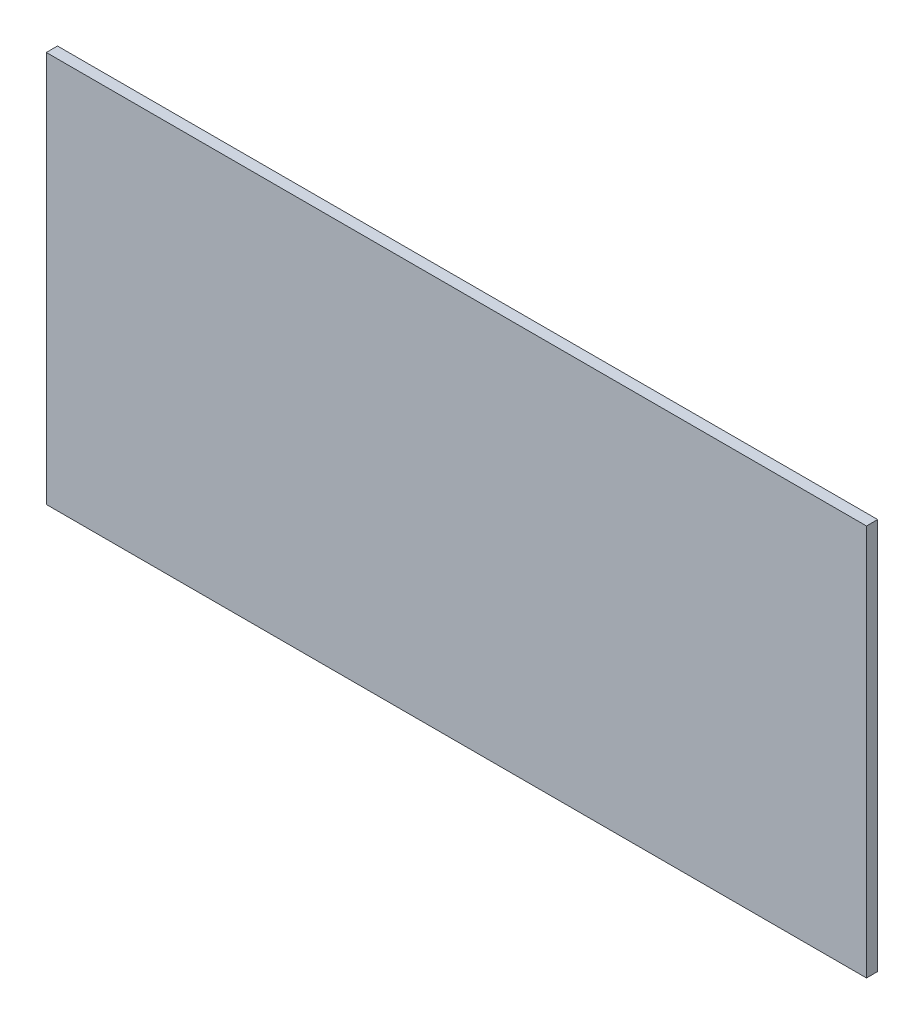
ISO-10303-21;
HEADER;
FILE_DESCRIPTION(('STEP AP214'),'2;1');
FILE_NAME('part.step','',(''),(''),'','','');
FILE_SCHEMA(('AUTOMOTIVE_DESIGN { 1 0 10303 214 1 1 1 1 }'));
ENDSEC;
DATA;
#1=APPLICATION_CONTEXT('core data for automotive mechanical design processes');
#2=APPLICATION_PROTOCOL_DEFINITION('international standard','automotive_design',2000,#1);
#3=PRODUCT_CONTEXT('',#1,'mechanical');
#4=PRODUCT('Part','Part','',(#3));
#5=PRODUCT_RELATED_PRODUCT_CATEGORY('part','',(#4));
#6=PRODUCT_DEFINITION_FORMATION('','',#4);
#7=PRODUCT_DEFINITION_CONTEXT('part definition',#1,'design');
#8=PRODUCT_DEFINITION('design','',#6,#7);
#9=PRODUCT_DEFINITION_SHAPE('','',#8);
#10=(LENGTH_UNIT() NAMED_UNIT(*) SI_UNIT(.MILLI.,.METRE.));
#11=(NAMED_UNIT(*) PLANE_ANGLE_UNIT() SI_UNIT($,.RADIAN.));
#12=(NAMED_UNIT(*) SI_UNIT($,.STERADIAN.) SOLID_ANGLE_UNIT());
#13=UNCERTAINTY_MEASURE_WITH_UNIT(LENGTH_MEASURE(1.E-05),#10,'distance_accuracy_value','');
#14=(GEOMETRIC_REPRESENTATION_CONTEXT(3) GLOBAL_UNCERTAINTY_ASSIGNED_CONTEXT((#13)) GLOBAL_UNIT_ASSIGNED_CONTEXT((#10,
#11,#12)) REPRESENTATION_CONTEXT('',''));
#15=CARTESIAN_POINT('',(0.,0.,0.));
#16=DIRECTION('',(0.,0.,1.));
#17=DIRECTION('',(1.,0.,0.));
#18=AXIS2_PLACEMENT_3D('',#15,#16,#17);
#19=CARTESIAN_POINT('',(139.7,-66.675,3.81));
#20=DIRECTION('',(-1.,0.,0.));
#21=DIRECTION('',(0.,0.,1.));
#22=AXIS2_PLACEMENT_3D('',#19,#20,#21);
#23=PLANE('',#22);
#24=DIRECTION('',(0.,1.,0.));
#25=VECTOR('',#24,1.);
#26=CARTESIAN_POINT('',(139.7,-66.675,0.));
#27=LINE('',#26,#25);
#28=CARTESIAN_POINT('',(139.7,-66.675,0.));
#29=VERTEX_POINT('',#28);
#30=CARTESIAN_POINT('',(139.7,66.675,0.));
#31=VERTEX_POINT('',#30);
#32=EDGE_CURVE('E96',#29,#31,#27,.T.);
#33=ORIENTED_EDGE('',*,*,#32,.T.);
#34=DIRECTION('',(0.,0.,-1.));
#35=VECTOR('',#34,1.);
#36=CARTESIAN_POINT('',(139.7,66.675,3.81));
#37=LINE('',#36,#35);
#38=CARTESIAN_POINT('',(139.7,66.675,3.81));
#39=VERTEX_POINT('',#38);
#40=EDGE_CURVE('E11',#39,#31,#37,.T.);
#41=ORIENTED_EDGE('',*,*,#40,.F.);
#42=DIRECTION('',(0.,1.,0.));
#43=VECTOR('',#42,1.);
#44=CARTESIAN_POINT('',(139.7,-66.675,3.81));
#45=LINE('',#44,#43);
#46=CARTESIAN_POINT('',(139.7,-66.675,3.81));
#47=VERTEX_POINT('',#46);
#48=EDGE_CURVE('E84',#47,#39,#45,.T.);
#49=ORIENTED_EDGE('',*,*,#48,.F.);
#50=DIRECTION('',(0.,0.,-1.));
#51=VECTOR('',#50,1.);
#52=CARTESIAN_POINT('',(139.7,-66.675,3.81));
#53=LINE('',#52,#51);
#54=EDGE_CURVE('E92',#47,#29,#53,.T.);
#55=ORIENTED_EDGE('',*,*,#54,.T.);
#56=EDGE_LOOP('',(#33,#41,#49,#55));
#57=FACE_BOUND('',#56,.T.);
#58=ADVANCED_FACE('F33',(#57),#23,.F.);
#59=CARTESIAN_POINT('',(-139.7,66.675,3.81));
#60=DIRECTION('',(0.,-1.,0.));
#61=DIRECTION('',(0.,0.,-1.));
#62=AXIS2_PLACEMENT_3D('',#59,#60,#61);
#63=PLANE('',#62);
#64=DIRECTION('',(-1.,0.,0.));
#65=VECTOR('',#64,1.);
#66=CARTESIAN_POINT('',(-139.7,66.675,0.));
#67=LINE('',#66,#65);
#68=CARTESIAN_POINT('',(-139.7,66.675,0.));
#69=VERTEX_POINT('',#68);
#70=EDGE_CURVE('E88',#31,#69,#67,.T.);
#71=ORIENTED_EDGE('',*,*,#70,.T.);
#72=DIRECTION('',(0.,0.,-1.));
#73=VECTOR('',#72,1.);
#74=CARTESIAN_POINT('',(-139.7,66.675,3.81));
#75=LINE('',#74,#73);
#76=CARTESIAN_POINT('',(-139.7,66.675,3.81));
#77=VERTEX_POINT('',#76);
#78=EDGE_CURVE('E41',#77,#69,#75,.T.);
#79=ORIENTED_EDGE('',*,*,#78,.F.);
#80=DIRECTION('',(-1.,0.,0.));
#81=VECTOR('',#80,1.);
#82=CARTESIAN_POINT('',(-139.7,66.675,3.81));
#83=LINE('',#82,#81);
#84=EDGE_CURVE('E79',#39,#77,#83,.T.);
#85=ORIENTED_EDGE('',*,*,#84,.F.);
#86=ORIENTED_EDGE('',*,*,#40,.T.);
#87=EDGE_LOOP('',(#71,#79,#85,#86));
#88=FACE_BOUND('',#87,.T.);
#89=ADVANCED_FACE('F87',(#88),#63,.F.);
#90=CARTESIAN_POINT('',(-139.7,-66.675,3.81));
#91=DIRECTION('',(1.,0.,0.));
#92=DIRECTION('',(0.,0.,-1.));
#93=AXIS2_PLACEMENT_3D('',#90,#91,#92);
#94=PLANE('',#93);
#95=DIRECTION('',(0.,-1.,0.));
#96=VECTOR('',#95,1.);
#97=CARTESIAN_POINT('',(-139.7,-66.675,0.));
#98=LINE('',#97,#96);
#99=CARTESIAN_POINT('',(-139.7,-66.675,0.));
#100=VERTEX_POINT('',#99);
#101=EDGE_CURVE('E66',#69,#100,#98,.T.);
#102=ORIENTED_EDGE('',*,*,#101,.T.);
#103=DIRECTION('',(0.,0.,-1.));
#104=VECTOR('',#103,1.);
#105=CARTESIAN_POINT('',(-139.7,-66.675,3.81));
#106=LINE('',#105,#104);
#107=CARTESIAN_POINT('',(-139.7,-66.675,3.81));
#108=VERTEX_POINT('',#107);
#109=EDGE_CURVE('E89',#108,#100,#106,.T.);
#110=ORIENTED_EDGE('',*,*,#109,.F.);
#111=DIRECTION('',(0.,-1.,0.));
#112=VECTOR('',#111,1.);
#113=CARTESIAN_POINT('',(-139.7,-66.675,3.81));
#114=LINE('',#113,#112);
#115=EDGE_CURVE('E82',#77,#108,#114,.T.);
#116=ORIENTED_EDGE('',*,*,#115,.F.);
#117=ORIENTED_EDGE('',*,*,#78,.T.);
#118=EDGE_LOOP('',(#102,#110,#116,#117));
#119=FACE_BOUND('',#118,.T.);
#120=ADVANCED_FACE('F90',(#119),#94,.F.);
#121=CARTESIAN_POINT('',(-139.7,-66.675,3.81));
#122=DIRECTION('',(0.,1.,0.));
#123=DIRECTION('',(0.,0.,1.));
#124=AXIS2_PLACEMENT_3D('',#121,#122,#123);
#125=PLANE('',#124);
#126=DIRECTION('',(1.,0.,0.));
#127=VECTOR('',#126,1.);
#128=CARTESIAN_POINT('',(-139.7,-66.675,0.));
#129=LINE('',#128,#127);
#130=EDGE_CURVE('E72',#100,#29,#129,.T.);
#131=ORIENTED_EDGE('',*,*,#130,.T.);
#132=ORIENTED_EDGE('',*,*,#54,.F.);
#133=DIRECTION('',(1.,0.,0.));
#134=VECTOR('',#133,1.);
#135=CARTESIAN_POINT('',(-139.7,-66.675,3.81));
#136=LINE('',#135,#134);
#137=EDGE_CURVE('E49',#108,#47,#136,.T.);
#138=ORIENTED_EDGE('',*,*,#137,.F.);
#139=ORIENTED_EDGE('',*,*,#109,.T.);
#140=EDGE_LOOP('',(#131,#132,#138,#139));
#141=FACE_BOUND('',#140,.T.);
#142=ADVANCED_FACE('F103',(#141),#125,.F.);
#143=CARTESIAN_POINT('',(0.,0.,3.81));
#144=DIRECTION('',(0.,0.,-1.));
#145=DIRECTION('',(-1.,0.,0.));
#146=AXIS2_PLACEMENT_3D('',#143,#144,#145);
#147=PLANE('',#146);
#148=ORIENTED_EDGE('',*,*,#48,.T.);
#149=ORIENTED_EDGE('',*,*,#84,.T.);
#150=ORIENTED_EDGE('',*,*,#115,.T.);
#151=ORIENTED_EDGE('',*,*,#137,.T.);
#152=EDGE_LOOP('',(#148,#149,#150,#151));
#153=FACE_BOUND('',#152,.T.);
#154=ADVANCED_FACE('F80',(#153),#147,.F.);
#155=CARTESIAN_POINT('',(0.,0.,0.));
#156=DIRECTION('',(0.,0.,-1.));
#157=DIRECTION('',(-1.,0.,0.));
#158=AXIS2_PLACEMENT_3D('',#155,#156,#157);
#159=PLANE('',#158);
#160=ORIENTED_EDGE('',*,*,#32,.F.);
#161=ORIENTED_EDGE('',*,*,#130,.F.);
#162=ORIENTED_EDGE('',*,*,#101,.F.);
#163=ORIENTED_EDGE('',*,*,#70,.F.);
#164=EDGE_LOOP('',(#160,#161,#162,#163));
#165=FACE_BOUND('',#164,.T.);
#166=ADVANCED_FACE('F106',(#165),#159,.T.);
#167=CLOSED_SHELL('',(#58,#89,#120,#142,#154,#166));
#168=MANIFOLD_SOLID_BREP('B2',#167);
#169=ADVANCED_BREP_SHAPE_REPRESENTATION('',(#18,#168),#14);
#170=SHAPE_DEFINITION_REPRESENTATION(#9,#169);
ENDSEC;
END-ISO-10303-21;
